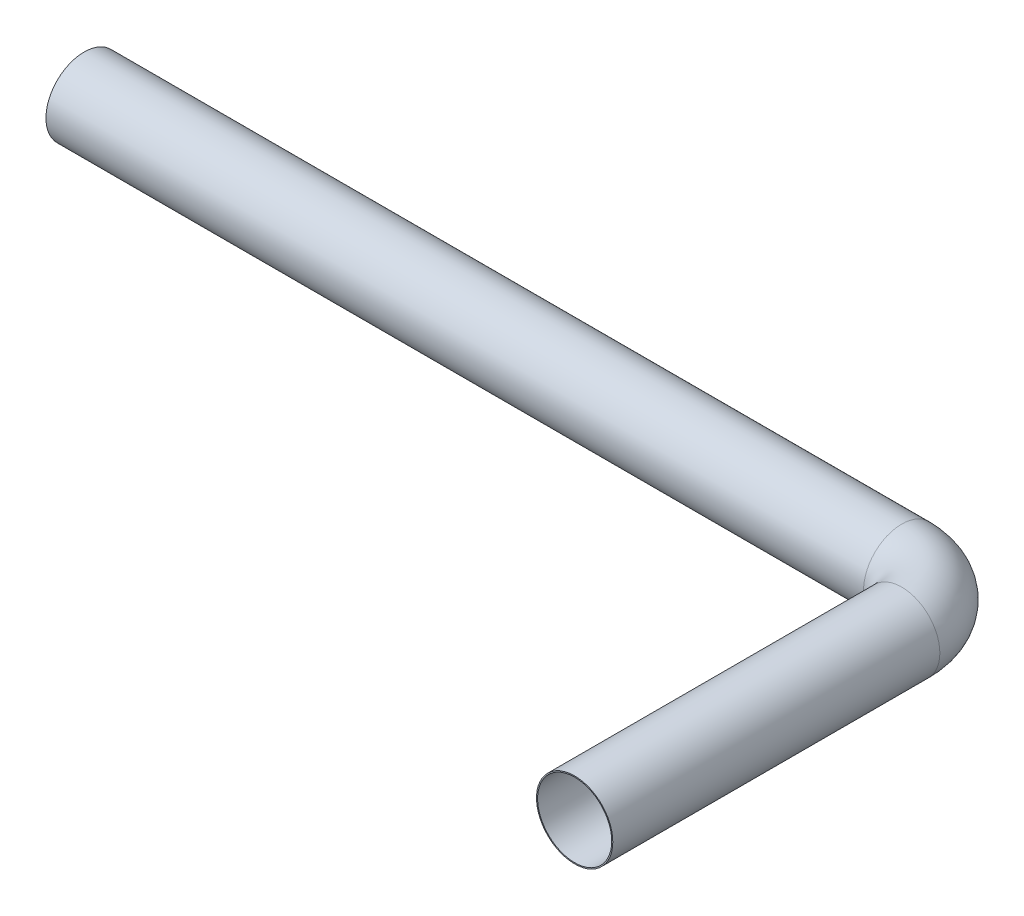
ISO-10303-21;
HEADER;
FILE_DESCRIPTION(('STEP AP214'),'2;1');
FILE_NAME('part.step','',(''),(''),'','','');
FILE_SCHEMA(('AUTOMOTIVE_DESIGN { 1 0 10303 214 1 1 1 1 }'));
ENDSEC;
DATA;
#1=APPLICATION_CONTEXT('core data for automotive mechanical design processes');
#2=APPLICATION_PROTOCOL_DEFINITION('international standard','automotive_design',2000,#1);
#3=PRODUCT_CONTEXT('',#1,'mechanical');
#4=PRODUCT('Part','Part','',(#3));
#5=PRODUCT_RELATED_PRODUCT_CATEGORY('part','',(#4));
#6=PRODUCT_DEFINITION_FORMATION('','',#4);
#7=PRODUCT_DEFINITION_CONTEXT('part definition',#1,'design');
#8=PRODUCT_DEFINITION('design','',#6,#7);
#9=PRODUCT_DEFINITION_SHAPE('','',#8);
#10=(LENGTH_UNIT() NAMED_UNIT(*) SI_UNIT(.MILLI.,.METRE.));
#11=(NAMED_UNIT(*) PLANE_ANGLE_UNIT() SI_UNIT($,.RADIAN.));
#12=(NAMED_UNIT(*) SI_UNIT($,.STERADIAN.) SOLID_ANGLE_UNIT());
#13=UNCERTAINTY_MEASURE_WITH_UNIT(LENGTH_MEASURE(1.E-05),#10,'distance_accuracy_value','');
#14=(GEOMETRIC_REPRESENTATION_CONTEXT(3) GLOBAL_UNCERTAINTY_ASSIGNED_CONTEXT((#13)) GLOBAL_UNIT_ASSIGNED_CONTEXT((#10,
#11,#12)) REPRESENTATION_CONTEXT('',''));
#15=CARTESIAN_POINT('',(0.,0.,0.));
#16=DIRECTION('',(0.,0.,1.));
#17=DIRECTION('',(1.,0.,0.));
#18=AXIS2_PLACEMENT_3D('',#15,#16,#17);
#19=CARTESIAN_POINT('',(0.,0.,0.));
#20=DIRECTION('',(1.,0.,0.));
#21=DIRECTION('',(0.,0.,-1.));
#22=AXIS2_PLACEMENT_3D('',#19,#20,#21);
#23=CYLINDRICAL_SURFACE('',#22,8.636);
#24=CARTESIAN_POINT('',(0.,-8.62759149473363,0.380999999999998));
#25=CARTESIAN_POINT('',(5.75715312215109,-8.62558206010737,0.426507179527249));
#26=CARTESIAN_POINT('',(11.5143062703665,-8.62321230992576,0.471998439204302));
#27=CARTESIAN_POINT('',(40.3000727814504,-8.60956448801749,0.699346739601795));
#28=CARTESIAN_POINT('',(63.3286864244408,-8.59288920391427,0.88087977030659));
#29=CARTESIAN_POINT('',(103.713249110372,-8.55360663570502,1.19798492406308));
#30=CARTESIAN_POINT('',(121.069198228534,-8.53347242777634,1.3338634022526));
#31=CARTESIAN_POINT('',(155.783431531465,-8.48674677060325,1.60452432611854));
#32=CARTESIAN_POINT('',(173.141715716234,-8.46015445296709,1.73930662187538));
#33=CARTESIAN_POINT('',(190.5,-8.43035903814476,1.87337729461286));
#34=B_SPLINE_CURVE_WITH_KNOTS('',3,(#24,#25,#26,#27,#28,#29,#30,#31,#32,#33),.UNSPECIFIED.,.F.,
.F.,(4,2,2,2,4),(0.,17.2720000338393,86.3600021991597,138.429479100649,190.505961421056),.UNSPECIFIED.);
#35=CARTESIAN_POINT('',(0.,-8.63186357926511,0.380773419868058));
#36=VERTEX_POINT('',#35);
#37=CARTESIAN_POINT('',(190.5,-8.43453953319041,1.87392681865593));
#38=VERTEX_POINT('',#37);
#39=EDGE_CURVE('E13',#36,#38,#34,.T.);
#40=ORIENTED_EDGE('',*,*,#39,.F.);
#41=CARTESIAN_POINT('',(0.,0.,0.));
#42=DIRECTION('',(1.,0.,0.));
#43=DIRECTION('',(0.,0.,-1.));
#44=AXIS2_PLACEMENT_3D('',#41,#42,#43);
#45=CIRCLE('',#44,8.636);
#46=CARTESIAN_POINT('',(0.,8.63182195092027,0.381992292864896));
#47=VERTEX_POINT('',#46);
#48=EDGE_CURVE('E114',#36,#47,#45,.F.);
#49=ORIENTED_EDGE('',*,*,#48,.T.);
#50=CARTESIAN_POINT('',(190.5,8.56267894952696,-1.12295378681756));
#51=CARTESIAN_POINT('',(184.74284687784,8.56860228138434,-1.07778903011525));
#52=CARTESIAN_POINT('',(178.985693729618,8.57416800728536,-1.03257738288013));
#53=CARTESIAN_POINT('',(150.199927218514,8.60020614424889,-0.806313097089592));
#54=CARTESIAN_POINT('',(127.171313575546,8.61530707551369,-0.624642325606103));
#55=CARTESIAN_POINT('',(86.7867508896345,8.63168603008376,-0.305533362491778));
#56=CARTESIAN_POINT('',(69.4308017714742,8.63545275609665,-0.168222914629587));
#57=CARTESIAN_POINT('',(34.7165684685428,8.63643674275693,0.106439886840424));
#58=CARTESIAN_POINT('',(17.3582842837716,8.63365312217214,0.243792243600783));
#59=CARTESIAN_POINT('',(0.,8.62759149473363,0.381));
#60=B_SPLINE_CURVE_WITH_KNOTS('',3,(#50,#51,#52,#53,#54,#55,#56,#57,#58,#59),.UNSPECIFIED.,.F.,
.F.,(4,2,2,2,4),(0.,17.2720000338393,86.3600021991591,138.429479100657,190.505961421056),.UNSPECIFIED.);
#61=CARTESIAN_POINT('',(190.5,8.56675314826946,-1.12418826293997));
#62=VERTEX_POINT('',#61);
#63=EDGE_CURVE('E98',#62,#47,#60,.T.);
#64=ORIENTED_EDGE('',*,*,#63,.F.);
#65=CARTESIAN_POINT('',(190.5,0.,0.));
#66=DIRECTION('',(1.,0.,0.));
#67=DIRECTION('',(0.,0.,-1.));
#68=AXIS2_PLACEMENT_3D('',#65,#66,#67);
#69=CIRCLE('',#68,8.636);
#70=EDGE_CURVE('E190',#38,#62,#69,.F.);
#71=ORIENTED_EDGE('',*,*,#70,.F.);
#72=EDGE_LOOP('',(#40,#49,#64,#71));
#73=FACE_BOUND('',#72,.T.);
#74=ADVANCED_FACE('F88',(#73),#23,.F.);
#75=CARTESIAN_POINT('',(0.,0.,0.));
#76=DIRECTION('',(1.,0.,0.));
#77=DIRECTION('',(0.,0.,-1.));
#78=AXIS2_PLACEMENT_3D('',#75,#76,#77);
#79=CYLINDRICAL_SURFACE('',#78,8.89);
#80=CARTESIAN_POINT('',(190.5,0.,0.));
#81=DIRECTION('',(1.,0.,0.));
#82=DIRECTION('',(0.,0.,-1.));
#83=AXIS2_PLACEMENT_3D('',#80,#81,#82);
#84=CIRCLE('',#83,8.89);
#85=CARTESIAN_POINT('',(190.5,0.,-8.89000000000002));
#86=VERTEX_POINT('',#85);
#87=EDGE_CURVE('E305',#86,#86,#84,.T.);
#88=ORIENTED_EDGE('',*,*,#87,.F.);
#89=EDGE_LOOP('',(#88));
#90=FACE_BOUND('',#89,.T.);
#91=CARTESIAN_POINT('',(0.,0.,0.));
#92=DIRECTION('',(1.,0.,0.));
#93=DIRECTION('',(0.,0.,-1.));
#94=AXIS2_PLACEMENT_3D('',#91,#92,#93);
#95=CIRCLE('',#94,8.89);
#96=CARTESIAN_POINT('',(0.,0.,-8.89));
#97=VERTEX_POINT('',#96);
#98=EDGE_CURVE('E300',#97,#97,#95,.T.);
#99=ORIENTED_EDGE('',*,*,#98,.T.);
#100=EDGE_LOOP('',(#99));
#101=FACE_BOUND('',#100,.T.);
#102=ADVANCED_FACE('F185',(#90,#101),#79,.T.);
#103=CARTESIAN_POINT('',(190.5,0.,12.7));
#104=DIRECTION('',(0.,-1.,0.));
#105=DIRECTION('',(0.,0.,-1.));
#106=AXIS2_PLACEMENT_3D('',#103,#104,#105);
#107=TOROIDAL_SURFACE('',#106,12.7,8.89);
#108=CARTESIAN_POINT('',(203.2,0.,12.7));
#109=DIRECTION('',(0.,0.,1.));
#110=DIRECTION('',(1.,0.,0.));
#111=AXIS2_PLACEMENT_3D('',#108,#109,#110);
#112=CIRCLE('',#111,8.89);
#113=CARTESIAN_POINT('',(212.09,0.,12.7));
#114=VERTEX_POINT('',#113);
#115=EDGE_CURVE('E304',#114,#114,#112,.T.);
#116=CARTESIAN_POINT('',(190.5,0.,12.7));
#117=DIRECTION('',(0.,-1.,0.));
#118=DIRECTION('',(0.,0.,-1.));
#119=AXIS2_PLACEMENT_3D('',#116,#117,#118);
#120=CIRCLE('',#119,21.59);
#121=EDGE_CURVE('',#86,#114,#120,.T.);
#122=ORIENTED_EDGE('',*,*,#87,.T.);
#123=ORIENTED_EDGE('',*,*,#115,.F.);
#124=ORIENTED_EDGE('',*,*,#121,.T.);
#125=ORIENTED_EDGE('',*,*,#121,.F.);
#126=EDGE_LOOP('',(#122,#124,#123,#125));
#127=FACE_BOUND('',#126,.T.);
#128=ADVANCED_FACE('F314',(#127),#107,.T.);
#129=CARTESIAN_POINT('',(203.2,0.,12.7));
#130=DIRECTION('',(0.,0.,1.));
#131=DIRECTION('',(1.,0.,0.));
#132=AXIS2_PLACEMENT_3D('',#129,#130,#131);
#133=CYLINDRICAL_SURFACE('',#132,8.89);
#134=CARTESIAN_POINT('',(203.2,0.,88.9));
#135=DIRECTION('',(0.,0.,1.));
#136=DIRECTION('',(1.,0.,0.));
#137=AXIS2_PLACEMENT_3D('',#134,#135,#136);
#138=CIRCLE('',#137,8.89);
#139=CARTESIAN_POINT('',(212.09,0.,88.9));
#140=VERTEX_POINT('',#139);
#141=EDGE_CURVE('E140',#140,#140,#138,.T.);
#142=ORIENTED_EDGE('',*,*,#141,.F.);
#143=EDGE_LOOP('',(#142));
#144=FACE_BOUND('',#143,.T.);
#145=ORIENTED_EDGE('',*,*,#115,.T.);
#146=EDGE_LOOP('',(#145));
#147=FACE_BOUND('',#146,.T.);
#148=ADVANCED_FACE('F90',(#144,#147),#133,.T.);
#149=CARTESIAN_POINT('',(0.,0.,0.));
#150=DIRECTION('',(1.,0.,0.));
#151=DIRECTION('',(0.,0.,-1.));
#152=AXIS2_PLACEMENT_3D('',#149,#150,#151);
#153=PLANE('',#152);
#154=ORIENTED_EDGE('',*,*,#48,.F.);
#155=DIRECTION('',(0.,1.,0.));
#156=VECTOR('',#155,1.);
#157=CARTESIAN_POINT('',(0.,8.636,0.381));
#158=LINE('',#157,#156);
#159=EDGE_CURVE('E159',#36,#47,#158,.T.);
#160=ORIENTED_EDGE('',*,*,#159,.T.);
#161=EDGE_LOOP('',(#154,#160));
#162=FACE_BOUND('',#161,.T.);
#163=DIRECTION('',(0.,-1.,0.));
#164=VECTOR('',#163,1.);
#165=CARTESIAN_POINT('',(0.,8.636,-0.381));
#166=LINE('',#165,#164);
#167=CARTESIAN_POINT('',(0.,8.63186357926511,-0.380773419868057));
#168=VERTEX_POINT('',#167);
#169=CARTESIAN_POINT('',(0.,-8.63187127381981,-0.380862391640192));
#170=VERTEX_POINT('',#169);
#171=EDGE_CURVE('E146',#168,#170,#166,.T.);
#172=ORIENTED_EDGE('',*,*,#171,.T.);
#173=EDGE_CURVE('E130',#168,#170,#45,.F.);
#174=ORIENTED_EDGE('',*,*,#173,.F.);
#175=EDGE_LOOP('',(#172,#174));
#176=FACE_BOUND('',#175,.T.);
#177=ORIENTED_EDGE('',*,*,#98,.F.);
#178=EDGE_LOOP('',(#177));
#179=FACE_BOUND('',#178,.T.);
#180=ADVANCED_FACE('F156',(#162,#176,#179),#153,.F.);
#181=CARTESIAN_POINT('',(203.2,0.,88.9));
#182=DIRECTION('',(0.,0.,1.));
#183=DIRECTION('',(1.,0.,0.));
#184=AXIS2_PLACEMENT_3D('',#181,#182,#183);
#185=PLANE('',#184);
#186=CARTESIAN_POINT('',(203.2,0.,88.9));
#187=DIRECTION('',(0.,0.,1.));
#188=DIRECTION('',(1.,0.,0.));
#189=AXIS2_PLACEMENT_3D('',#186,#187,#188);
#190=CIRCLE('',#189,8.636);
#191=CARTESIAN_POINT('',(211.836,0.,88.9));
#192=VERTEX_POINT('',#191);
#193=EDGE_CURVE('E151',#192,#192,#190,.F.);
#194=ORIENTED_EDGE('',*,*,#193,.T.);
#195=EDGE_LOOP('',(#194));
#196=FACE_BOUND('',#195,.T.);
#197=ORIENTED_EDGE('',*,*,#141,.T.);
#198=EDGE_LOOP('',(#197));
#199=FACE_BOUND('',#198,.T.);
#200=ADVANCED_FACE('F182',(#196,#199),#185,.T.);
#201=CARTESIAN_POINT('',(0.,8.62759149473363,-0.381000000000001));
#202=CARTESIAN_POINT('',(5.75715312215109,8.62558206010737,-0.426507179527251));
#203=CARTESIAN_POINT('',(11.5143062703665,8.62321230992576,-0.471998439204302));
#204=CARTESIAN_POINT('',(40.3000727814504,8.60956448801749,-0.699346739601793));
#205=CARTESIAN_POINT('',(63.3286864244408,8.59288920391427,-0.880879770306589));
#206=CARTESIAN_POINT('',(103.713249110372,8.55360663570502,-1.19798492406308));
#207=CARTESIAN_POINT('',(121.069198228534,8.53347242777634,-1.3338634022526));
#208=CARTESIAN_POINT('',(155.783431531465,8.48674677060325,-1.60452432611853));
#209=CARTESIAN_POINT('',(173.141715716234,8.46015445296709,-1.73930662187538));
#210=CARTESIAN_POINT('',(190.5,8.43035903814476,-1.87337729461286));
#211=B_SPLINE_CURVE_WITH_KNOTS('',3,(#201,#202,#203,#204,#205,#206,#207,#208,#209,#210),
.UNSPECIFIED.,.F.,.F.,(4,2,2,2,4),(0.,17.2720000338393,86.3600021991596,138.429479100649,
190.505961421056),.UNSPECIFIED.);
#212=CARTESIAN_POINT('',(190.5,8.43453953319041,-1.87392681865593));
#213=VERTEX_POINT('',#212);
#214=EDGE_CURVE('E105',#168,#213,#211,.T.);
#215=ORIENTED_EDGE('',*,*,#214,.F.);
#216=ORIENTED_EDGE('',*,*,#173,.T.);
#217=CARTESIAN_POINT('',(190.5,-8.56267894952696,1.12295378681756));
#218=CARTESIAN_POINT('',(184.74284687784,-8.56860228138434,1.07778903011525));
#219=CARTESIAN_POINT('',(178.985693729618,-8.57416800728537,1.03257738288013));
#220=CARTESIAN_POINT('',(150.199927218514,-8.6002061442489,0.806313097089594));
#221=CARTESIAN_POINT('',(127.171313575546,-8.6153070755137,0.624642325606103));
#222=CARTESIAN_POINT('',(86.7867508896345,-8.63168603008376,0.305533362491778));
#223=CARTESIAN_POINT('',(69.4308017714743,-8.63545275609665,0.168222914629587));
#224=CARTESIAN_POINT('',(34.7165684685428,-8.63643674275693,-0.106439886840424));
#225=CARTESIAN_POINT('',(17.3582842837716,-8.63365312217214,-0.243792243600783));
#226=CARTESIAN_POINT('',(0.,-8.62759149473363,-0.381));
#227=B_SPLINE_CURVE_WITH_KNOTS('',3,(#217,#218,#219,#220,#221,#222,#223,#224,#225,#226),
.UNSPECIFIED.,.F.,.F.,(4,2,2,2,4),(0.,17.2720000338393,86.360002199159,138.429479100657,
190.505961421056),.UNSPECIFIED.);
#228=CARTESIAN_POINT('',(190.5,-8.56679525346228,1.12386740493974));
#229=VERTEX_POINT('',#228);
#230=EDGE_CURVE('E133',#229,#170,#227,.T.);
#231=ORIENTED_EDGE('',*,*,#230,.F.);
#232=EDGE_CURVE('E201',#213,#229,#69,.F.);
#233=ORIENTED_EDGE('',*,*,#232,.F.);
#234=EDGE_LOOP('',(#215,#216,#231,#233));
#235=FACE_BOUND('',#234,.T.);
#236=ADVANCED_FACE('F132',(#235),#23,.F.);
#237=CARTESIAN_POINT('',(190.5,0.,12.7));
#238=DIRECTION('',(0.,-1.,0.));
#239=DIRECTION('',(0.,0.,-1.));
#240=AXIS2_PLACEMENT_3D('',#237,#238,#239);
#241=TOROIDAL_SURFACE('',#240,12.7,8.636);
#242=CARTESIAN_POINT('',(203.2,0.,12.7));
#243=DIRECTION('',(0.,0.,1.));
#244=DIRECTION('',(1.,0.,0.));
#245=AXIS2_PLACEMENT_3D('',#242,#243,#244);
#246=CIRCLE('',#245,8.636);
#247=CARTESIAN_POINT('',(211.836,0.,12.7));
#248=VERTEX_POINT('',#247);
#249=EDGE_CURVE('E219',#248,#248,#246,.F.);
#250=ORIENTED_EDGE('',*,*,#249,.F.);
#251=EDGE_LOOP('',(#250));
#252=FACE_BOUND('',#251,.T.);
#253=EDGE_CURVE('E200',#229,#38,#69,.F.);
#254=ORIENTED_EDGE('',*,*,#253,.T.);
#255=ORIENTED_EDGE('',*,*,#70,.T.);
#256=CARTESIAN_POINT('',(190.5,0.,0.));
#257=DIRECTION('',(-1.,0.,0.));
#258=DIRECTION('',(0.,0.,1.));
#259=AXIS2_PLACEMENT_3D('',#256,#257,#258);
#260=CIRCLE('',#259,8.636);
#261=EDGE_CURVE('E308',#62,#213,#260,.T.);
#262=ORIENTED_EDGE('',*,*,#261,.T.);
#263=ORIENTED_EDGE('',*,*,#232,.T.);
#264=EDGE_LOOP('',(#254,#255,#262,#263));
#265=FACE_BOUND('',#264,.T.);
#266=ADVANCED_FACE('F332',(#252,#265),#241,.F.);
#267=CARTESIAN_POINT('',(203.2,0.,12.7));
#268=DIRECTION('',(0.,0.,1.));
#269=DIRECTION('',(1.,0.,0.));
#270=AXIS2_PLACEMENT_3D('',#267,#268,#269);
#271=CYLINDRICAL_SURFACE('',#270,8.636);
#272=ORIENTED_EDGE('',*,*,#193,.F.);
#273=EDGE_LOOP('',(#272));
#274=FACE_BOUND('',#273,.T.);
#275=ORIENTED_EDGE('',*,*,#249,.T.);
#276=EDGE_LOOP('',(#275));
#277=FACE_BOUND('',#276,.T.);
#278=ADVANCED_FACE('F325',(#274,#277),#271,.F.);
#279=CARTESIAN_POINT('',(190.5,0.,0.));
#280=DIRECTION('',(-1.,0.,0.));
#281=DIRECTION('',(0.,0.173648177666931,0.984807753012208));
#282=AXIS2_PLACEMENT_3D('',#279,#280,#281);
#283=PLANE('',#282);
#284=DIRECTION('',(0.,-0.984807753012208,0.173648177666931));
#285=VECTOR('',#284,1.);
#286=CARTESIAN_POINT('',(190.5,8.43863979932233,-1.87483741622927));
#287=LINE('',#286,#285);
#288=EDGE_CURVE('E149',#213,#229,#287,.T.);
#289=ORIENTED_EDGE('',*,*,#288,.F.);
#290=ORIENTED_EDGE('',*,*,#261,.F.);
#291=DIRECTION('',(0.,0.984807753012208,-0.173648177666931));
#292=VECTOR('',#291,1.);
#293=CARTESIAN_POINT('',(190.5,8.57095971070453,-1.12441390843397));
#294=LINE('',#293,#292);
#295=EDGE_CURVE('E337',#38,#62,#294,.T.);
#296=ORIENTED_EDGE('',*,*,#295,.F.);
#297=ORIENTED_EDGE('',*,*,#253,.F.);
#298=EDGE_LOOP('',(#289,#290,#296,#297));
#299=FACE_BOUND('',#298,.T.);
#300=ADVANCED_FACE('F250',(#299),#283,.F.);
#301=CARTESIAN_POINT('',(0.,8.636,0.381));
#302=CARTESIAN_POINT('',(1.48166666292651,8.63650337937786,0.369276207783035));
#303=CARTESIAN_POINT('',(4.44499998877947,8.63751013813357,0.345828623349107));
#304=CARTESIAN_POINT('',(9.7366666420461,8.63909244438887,0.303949127397299));
#305=CARTESIAN_POINT('',(19.4733333030388,8.64162209247576,0.226877302409077));
#306=CARTESIAN_POINT('',(32.3849999844054,8.6438072781625,0.1246386557782));
#307=CARTESIAN_POINT('',(51.8583333152846,8.64486568081267,-0.0295868236163194));
#308=CARTESIAN_POINT('',(72.390000009694,8.64295244621016,-0.192195549850308));
#309=CARTESIAN_POINT('',(97.1549999911747,8.63636790827504,-0.388229260141375));
#310=CARTESIAN_POINT('',(120.01500000745,8.62634281179973,-0.569012903569126));
#311=CARTESIAN_POINT('',(141.816666675525,8.61302421077305,-0.741172526150986));
#312=CARTESIAN_POINT('',(159.385000022498,8.59983056675996,-0.879688834276811));
#313=CARTESIAN_POINT('',(172.931666694449,8.5881081415703,-0.986336409147226));
#314=CARTESIAN_POINT('',(181.715833355886,8.57977727735978,-1.05540566790542));
#315=CARTESIAN_POINT('',(187.007500008797,8.5745321228953,-1.09698546688852));
#316=CARTESIAN_POINT('',(189.335833336266,8.57215051476812,-1.11527109458549));
#317=CARTESIAN_POINT('',(190.5,8.57095971070453,-1.12441390843397));
#318=CARTESIAN_POINT('',(0.,-8.636,0.381));
#319=CARTESIAN_POINT('',(1.48166666292651,-8.63546898091178,0.392722573010523));
#320=CARTESIAN_POINT('',(4.44499998877947,-8.63440694273535,0.416167719031569));
#321=CARTESIAN_POINT('',(9.7366666420461,-8.63229503002697,0.458023852442008));
#322=CARTESIAN_POINT('',(19.4733333030388,-8.62802760501161,0.535019015615391));
#323=CARTESIAN_POINT('',(32.3849999844054,-8.6212007678988,0.63705288245986));
#324=CARTESIAN_POINT('',(51.8583333152846,-8.60867336393201,0.790772364668676));
#325=CARTESIAN_POINT('',(72.390000009694,-8.59244760360465,0.952580860290259));
#326=CARTESIAN_POINT('',(97.1549999911747,-8.56862515926587,1.14727306477322));
#327=CARTESIAN_POINT('',(120.01500000745,-8.54271849805887,1.32647150509605));
#328=CARTESIAN_POINT('',(141.816666675525,-8.51429059923048,1.49678935067178));
#329=CARTESIAN_POINT('',(159.385000022498,-8.48894992754883,1.63360562884395));
#330=CARTESIAN_POINT('',(172.931666694449,-8.46788124578367,1.73880653616983));
#331=CARTESIAN_POINT('',(181.715833355886,-8.45350024176063,1.80687379620201));
#332=CARTESIAN_POINT('',(187.007500008797,-8.44461378724676,1.84783013974584));
#333=CARTESIAN_POINT('',(189.335833336266,-8.44063112863047,1.86583499073479));
#334=CARTESIAN_POINT('',(190.5,-8.43863979932233,1.87483741622927));
#335=B_SPLINE_SURFACE_WITH_KNOTS('',1,3,((#301,#302,#303,#304,#305,#306,#307,#308,#309,#310,
#311,#312,#313,#314,#315,#316,#317),(#318,#319,#320,#321,#322,#323,#324,#325,#326,#327,#328,
#329,#330,#331,#332,#333,#334)),.UNSPECIFIED.,.F.,.F.,.F.,(2,2),(4,1,1,1,1,1,1,1,1,1,1,1,1,1,4),
(0.,1.),(0.,0.0233333332887088,0.0466666665774166,0.0833333331722155,0.176666666634664,
0.250000000083961,0.390000000010016,0.500000000001173,0.639999999927253,0.749999999918386,
0.843333333380749,0.916666666830128,0.963333333403003,0.981666666701503,1.),.UNSPECIFIED.);
#336=ORIENTED_EDGE('',*,*,#159,.F.);
#337=ORIENTED_EDGE('',*,*,#39,.T.);
#338=ORIENTED_EDGE('',*,*,#295,.T.);
#339=ORIENTED_EDGE('',*,*,#63,.T.);
#340=EDGE_LOOP('',(#336,#337,#338,#339));
#341=FACE_BOUND('',#340,.T.);
#342=ADVANCED_FACE('F245',(#341),#335,.T.);
#343=CARTESIAN_POINT('',(0.,-8.636,-0.381));
#344=CARTESIAN_POINT('',(1.48166666292651,-8.63650337937785,-0.369276207783035));
#345=CARTESIAN_POINT('',(4.44499998877947,-8.63751013813357,-0.345828623349107));
#346=CARTESIAN_POINT('',(9.7366666420461,-8.63909244438887,-0.303949127397299));
#347=CARTESIAN_POINT('',(19.4733333030388,-8.64162209247575,-0.226877302409076));
#348=CARTESIAN_POINT('',(32.3849999844054,-8.64380727816251,-0.1246386557782));
#349=CARTESIAN_POINT('',(51.8583333152846,-8.64486568081267,0.0295868236163194));
#350=CARTESIAN_POINT('',(72.390000009694,-8.64295244621016,0.192195549850308));
#351=CARTESIAN_POINT('',(97.1549999911747,-8.63636790827503,0.388229260141375));
#352=CARTESIAN_POINT('',(120.01500000745,-8.62634281179973,0.569012903569126));
#353=CARTESIAN_POINT('',(141.816666675525,-8.61302421077304,0.741172526150985));
#354=CARTESIAN_POINT('',(159.385000022498,-8.59983056675996,0.87968883427681));
#355=CARTESIAN_POINT('',(172.931666694449,-8.58810814157031,0.986336409147226));
#356=CARTESIAN_POINT('',(181.715833355886,-8.57977727735977,1.05540566790542));
#357=CARTESIAN_POINT('',(187.007500008797,-8.5745321228953,1.09698546688852));
#358=CARTESIAN_POINT('',(189.335833336266,-8.57215051476812,1.11527109458548));
#359=CARTESIAN_POINT('',(190.5,-8.57095971070453,1.12441390843397));
#360=CARTESIAN_POINT('',(0.,8.636,-0.381));
#361=CARTESIAN_POINT('',(1.48166666292651,8.63546898091179,-0.392722573010523));
#362=CARTESIAN_POINT('',(4.44499998877947,8.63440694273535,-0.416167719031569));
#363=CARTESIAN_POINT('',(9.7366666420461,8.63229503002697,-0.458023852442008));
#364=CARTESIAN_POINT('',(19.4733333030388,8.62802760501161,-0.535019015615391));
#365=CARTESIAN_POINT('',(32.3849999844054,8.62120076789879,-0.637052882459859));
#366=CARTESIAN_POINT('',(51.8583333152846,8.60867336393201,-0.790772364668676));
#367=CARTESIAN_POINT('',(72.390000009694,8.59244760360465,-0.952580860290259));
#368=CARTESIAN_POINT('',(97.1549999911747,8.56862515926588,-1.14727306477322));
#369=CARTESIAN_POINT('',(120.01500000745,8.54271849805887,-1.32647150509605));
#370=CARTESIAN_POINT('',(141.816666675525,8.51429059923049,-1.49678935067178));
#371=CARTESIAN_POINT('',(159.385000022498,8.48894992754883,-1.63360562884395));
#372=CARTESIAN_POINT('',(172.931666694449,8.46788124578366,-1.73880653616983));
#373=CARTESIAN_POINT('',(181.715833355886,8.45350024176064,-1.80687379620201));
#374=CARTESIAN_POINT('',(187.007500008797,8.44461378724676,-1.84783013974584));
#375=CARTESIAN_POINT('',(189.335833336266,8.44063112863047,-1.86583499073479));
#376=CARTESIAN_POINT('',(190.5,8.43863979932233,-1.87483741622927));
#377=B_SPLINE_SURFACE_WITH_KNOTS('',1,3,((#343,#344,#345,#346,#347,#348,#349,#350,#351,#352,
#353,#354,#355,#356,#357,#358,#359),(#360,#361,#362,#363,#364,#365,#366,#367,#368,#369,#370,
#371,#372,#373,#374,#375,#376)),.UNSPECIFIED.,.F.,.F.,.F.,(2,2),(4,1,1,1,1,1,1,1,1,1,1,1,1,1,4),
(0.,1.),(0.,0.0233333332887088,0.0466666665774166,0.0833333331722155,0.176666666634664,
0.250000000083961,0.390000000010016,0.500000000001173,0.639999999927253,0.749999999918386,
0.843333333380749,0.916666666830128,0.963333333403003,0.981666666701503,1.),.UNSPECIFIED.);
#378=ORIENTED_EDGE('',*,*,#171,.F.);
#379=ORIENTED_EDGE('',*,*,#214,.T.);
#380=ORIENTED_EDGE('',*,*,#288,.T.);
#381=ORIENTED_EDGE('',*,*,#230,.T.);
#382=EDGE_LOOP('',(#378,#379,#380,#381));
#383=FACE_BOUND('',#382,.T.);
#384=ADVANCED_FACE('F145',(#383),#377,.T.);
#385=CLOSED_SHELL('',(#74,#102,#128,#148,#180,#200,#236,#266,#278,#300,#342,#384));
#386=MANIFOLD_SOLID_BREP('B2',#385);
#387=ADVANCED_BREP_SHAPE_REPRESENTATION('',(#18,#386),#14);
#388=SHAPE_DEFINITION_REPRESENTATION(#9,#387);
ENDSEC;
END-ISO-10303-21;
